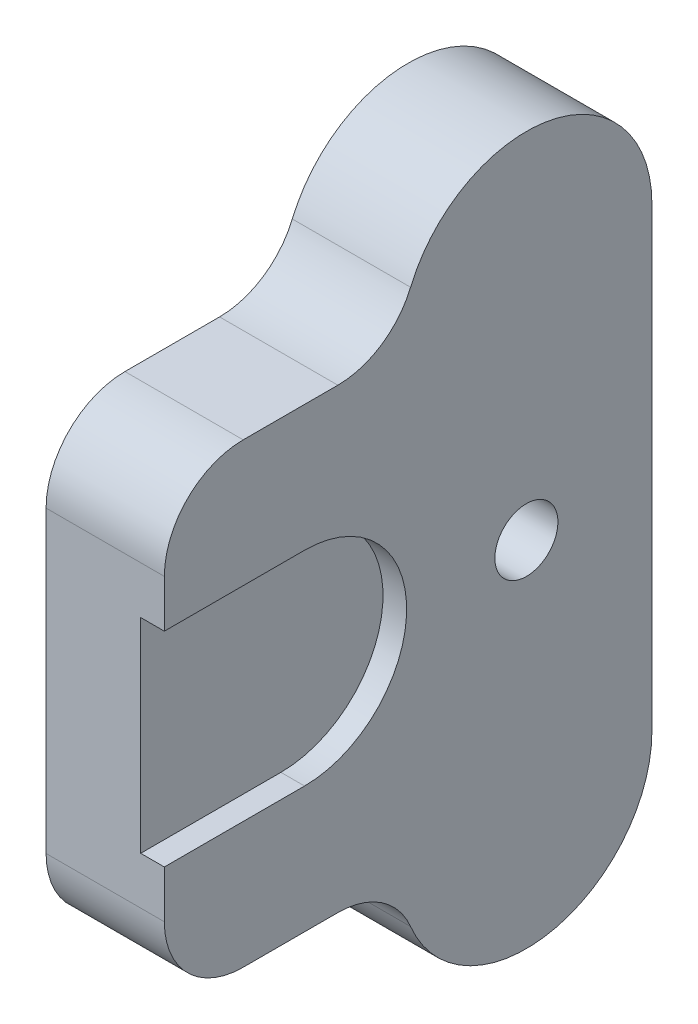
ISO-10303-21;
HEADER;
FILE_DESCRIPTION(('STEP AP214'),'2;1');
FILE_NAME('part.step','',(''),(''),'','','');
FILE_SCHEMA(('AUTOMOTIVE_DESIGN { 1 0 10303 214 1 1 1 1 }'));
ENDSEC;
DATA;
#1=APPLICATION_CONTEXT('core data for automotive mechanical design processes');
#2=APPLICATION_PROTOCOL_DEFINITION('international standard','automotive_design',2000,#1);
#3=PRODUCT_CONTEXT('',#1,'mechanical');
#4=PRODUCT('Part','Part','',(#3));
#5=PRODUCT_RELATED_PRODUCT_CATEGORY('part','',(#4));
#6=PRODUCT_DEFINITION_FORMATION('','',#4);
#7=PRODUCT_DEFINITION_CONTEXT('part definition',#1,'design');
#8=PRODUCT_DEFINITION('design','',#6,#7);
#9=PRODUCT_DEFINITION_SHAPE('','',#8);
#10=(LENGTH_UNIT() NAMED_UNIT(*) SI_UNIT(.MILLI.,.METRE.));
#11=(NAMED_UNIT(*) PLANE_ANGLE_UNIT() SI_UNIT($,.RADIAN.));
#12=(NAMED_UNIT(*) SI_UNIT($,.STERADIAN.) SOLID_ANGLE_UNIT());
#13=UNCERTAINTY_MEASURE_WITH_UNIT(LENGTH_MEASURE(1.E-05),#10,'distance_accuracy_value','');
#14=(GEOMETRIC_REPRESENTATION_CONTEXT(3) GLOBAL_UNCERTAINTY_ASSIGNED_CONTEXT((#13)) GLOBAL_UNIT_ASSIGNED_CONTEXT((#10,
#11,#12)) REPRESENTATION_CONTEXT('',''));
#15=CARTESIAN_POINT('',(0.,0.,0.));
#16=DIRECTION('',(0.,0.,1.));
#17=DIRECTION('',(1.,0.,0.));
#18=AXIS2_PLACEMENT_3D('',#15,#16,#17);
#19=CARTESIAN_POINT('',(15.,-28.9686177509747,3.13232637331732));
#20=DIRECTION('',(-1.,0.,0.));
#21=DIRECTION('',(0.,0.,1.));
#22=AXIS2_PLACEMENT_3D('',#19,#20,#21);
#23=CYLINDRICAL_SURFACE('',#22,15.921660548038);
#24=CARTESIAN_POINT('',(0.,-28.9686177509747,3.13232637331732));
#25=DIRECTION('',(1.,0.,0.));
#26=DIRECTION('',(0.,0.,-1.));
#27=AXIS2_PLACEMENT_3D('',#24,#25,#26);
#28=CIRCLE('',#27,15.921660548038);
#29=CARTESIAN_POINT('',(0.,-35.1108402056403,17.821518928538));
#30=VERTEX_POINT('',#29);
#31=CARTESIAN_POINT('',(0.,-28.9686177509747,-12.7893341747207));
#32=VERTEX_POINT('',#31);
#33=EDGE_CURVE('E168',#30,#32,#28,.T.);
#34=ORIENTED_EDGE('',*,*,#33,.T.);
#35=DIRECTION('',(-1.,0.,0.));
#36=VECTOR('',#35,1.);
#37=CARTESIAN_POINT('',(15.,-28.9686177509747,-12.7893341747207));
#38=LINE('',#37,#36);
#39=CARTESIAN_POINT('',(15.,-28.9686177509747,-12.7893341747207));
#40=VERTEX_POINT('',#39);
#41=EDGE_CURVE('E11',#40,#32,#38,.T.);
#42=ORIENTED_EDGE('',*,*,#41,.F.);
#43=CARTESIAN_POINT('',(15.,-28.9686177509747,3.13232637331732));
#44=DIRECTION('',(1.,0.,0.));
#45=DIRECTION('',(0.,0.,-1.));
#46=AXIS2_PLACEMENT_3D('',#43,#44,#45);
#47=CIRCLE('',#46,15.921660548038);
#48=CARTESIAN_POINT('',(15.,-35.1108402056403,17.821518928538));
#49=VERTEX_POINT('',#48);
#50=EDGE_CURVE('E188',#49,#40,#47,.T.);
#51=ORIENTED_EDGE('',*,*,#50,.F.);
#52=DIRECTION('',(-1.,0.,0.));
#53=VECTOR('',#52,1.);
#54=CARTESIAN_POINT('',(15.,-35.1108402056403,17.821518928538));
#55=LINE('',#54,#53);
#56=EDGE_CURVE('E164',#49,#30,#55,.T.);
#57=ORIENTED_EDGE('',*,*,#56,.T.);
#58=EDGE_LOOP('',(#34,#42,#51,#57));
#59=FACE_BOUND('',#58,.T.);
#60=ADVANCED_FACE('F45',(#59),#23,.T.);
#61=CARTESIAN_POINT('',(15.,-28.9686177509747,-12.7893341747207));
#62=DIRECTION('',(0.,0.,1.));
#63=DIRECTION('',(1.,0.,0.));
#64=AXIS2_PLACEMENT_3D('',#61,#62,#63);
#65=PLANE('',#64);
#66=DIRECTION('',(0.,1.,0.));
#67=VECTOR('',#66,1.);
#68=CARTESIAN_POINT('',(0.,-28.9686177509747,-12.7893341747207));
#69=LINE('',#68,#67);
#70=CARTESIAN_POINT('',(0.,28.9686177509747,-12.7893341747207));
#71=VERTEX_POINT('',#70);
#72=EDGE_CURVE('E171',#32,#71,#69,.T.);
#73=ORIENTED_EDGE('',*,*,#72,.T.);
#74=DIRECTION('',(-1.,0.,0.));
#75=VECTOR('',#74,1.);
#76=CARTESIAN_POINT('',(15.,28.9686177509747,-12.7893341747207));
#77=LINE('',#76,#75);
#78=CARTESIAN_POINT('',(15.,28.9686177509747,-12.7893341747207));
#79=VERTEX_POINT('',#78);
#80=EDGE_CURVE('E52',#79,#71,#77,.T.);
#81=ORIENTED_EDGE('',*,*,#80,.F.);
#82=DIRECTION('',(0.,1.,0.));
#83=VECTOR('',#82,1.);
#84=CARTESIAN_POINT('',(15.,-28.9686177509747,-12.7893341747207));
#85=LINE('',#84,#83);
#86=EDGE_CURVE('E115',#40,#79,#85,.T.);
#87=ORIENTED_EDGE('',*,*,#86,.F.);
#88=ORIENTED_EDGE('',*,*,#41,.T.);
#89=EDGE_LOOP('',(#73,#81,#87,#88));
#90=FACE_BOUND('',#89,.T.);
#91=ADVANCED_FACE('F273',(#90),#65,.F.);
#92=CARTESIAN_POINT('',(15.,28.9686177509747,3.13232637331732));
#93=DIRECTION('',(-1.,0.,0.));
#94=DIRECTION('',(0.,0.,1.));
#95=AXIS2_PLACEMENT_3D('',#92,#93,#94);
#96=CYLINDRICAL_SURFACE('',#95,15.921660548038);
#97=CARTESIAN_POINT('',(0.,28.9686177509747,3.13232637331732));
#98=DIRECTION('',(1.,0.,0.));
#99=DIRECTION('',(0.,0.,1.));
#100=AXIS2_PLACEMENT_3D('',#97,#98,#99);
#101=CIRCLE('',#100,15.921660548038);
#102=CARTESIAN_POINT('',(0.,35.1108402056403,17.821518928538));
#103=VERTEX_POINT('',#102);
#104=EDGE_CURVE('E174',#71,#103,#101,.T.);
#105=ORIENTED_EDGE('',*,*,#104,.T.);
#106=DIRECTION('',(-1.,0.,0.));
#107=VECTOR('',#106,1.);
#108=CARTESIAN_POINT('',(15.,35.1108402056403,17.821518928538));
#109=LINE('',#108,#107);
#110=CARTESIAN_POINT('',(15.,35.1108402056403,17.821518928538));
#111=VERTEX_POINT('',#110);
#112=EDGE_CURVE('E201',#111,#103,#109,.T.);
#113=ORIENTED_EDGE('',*,*,#112,.F.);
#114=CARTESIAN_POINT('',(15.,28.9686177509747,3.13232637331732));
#115=DIRECTION('',(1.,0.,0.));
#116=DIRECTION('',(0.,0.,1.));
#117=AXIS2_PLACEMENT_3D('',#114,#115,#116);
#118=CIRCLE('',#117,15.921660548038);
#119=EDGE_CURVE('E209',#79,#111,#118,.T.);
#120=ORIENTED_EDGE('',*,*,#119,.F.);
#121=ORIENTED_EDGE('',*,*,#80,.T.);
#122=EDGE_LOOP('',(#105,#113,#120,#121));
#123=FACE_BOUND('',#122,.T.);
#124=ADVANCED_FACE('F207',(#123),#96,.T.);
#125=CARTESIAN_POINT('',(15.,38.9686177509747,27.0474363577541));
#126=DIRECTION('',(-1.,0.,0.));
#127=DIRECTION('',(0.,0.,1.));
#128=AXIS2_PLACEMENT_3D('',#125,#126,#127);
#129=CYLINDRICAL_SURFACE('',#128,9.99999999999999);
#130=CARTESIAN_POINT('',(0.,38.9686177509747,27.0474363577541));
#131=DIRECTION('',(-1.,0.,0.));
#132=DIRECTION('',(0.,0.,1.));
#133=AXIS2_PLACEMENT_3D('',#130,#131,#132);
#134=CIRCLE('',#133,9.99999999999999);
#135=CARTESIAN_POINT('',(0.,28.9686177509747,27.0474363577541));
#136=VERTEX_POINT('',#135);
#137=EDGE_CURVE('E176',#103,#136,#134,.T.);
#138=ORIENTED_EDGE('',*,*,#137,.T.);
#139=DIRECTION('',(-1.,0.,0.));
#140=VECTOR('',#139,1.);
#141=CARTESIAN_POINT('',(15.,28.9686177509747,27.0474363577541));
#142=LINE('',#141,#140);
#143=CARTESIAN_POINT('',(15.,28.9686177509747,27.0474363577541));
#144=VERTEX_POINT('',#143);
#145=EDGE_CURVE('E198',#144,#136,#142,.T.);
#146=ORIENTED_EDGE('',*,*,#145,.F.);
#147=CARTESIAN_POINT('',(15.,38.9686177509747,27.0474363577541));
#148=DIRECTION('',(-1.,0.,0.));
#149=DIRECTION('',(0.,0.,1.));
#150=AXIS2_PLACEMENT_3D('',#147,#148,#149);
#151=CIRCLE('',#150,9.99999999999999);
#152=EDGE_CURVE('E227',#111,#144,#151,.T.);
#153=ORIENTED_EDGE('',*,*,#152,.F.);
#154=ORIENTED_EDGE('',*,*,#112,.T.);
#155=EDGE_LOOP('',(#138,#146,#153,#154));
#156=FACE_BOUND('',#155,.T.);
#157=ADVANCED_FACE('F218',(#156),#129,.F.);
#158=CARTESIAN_POINT('',(15.,28.9686177509747,39.0539869213552));
#159=DIRECTION('',(0.,-1.,0.));
#160=DIRECTION('',(0.,0.,-1.));
#161=AXIS2_PLACEMENT_3D('',#158,#159,#160);
#162=PLANE('',#161);
#163=DIRECTION('',(0.,0.,1.));
#164=VECTOR('',#163,1.);
#165=CARTESIAN_POINT('',(0.,28.9686177509747,39.0539869213552));
#166=LINE('',#165,#164);
#167=CARTESIAN_POINT('',(0.,28.9686177509747,39.0539869213552));
#168=VERTEX_POINT('',#167);
#169=EDGE_CURVE('E178',#136,#168,#166,.T.);
#170=ORIENTED_EDGE('',*,*,#169,.T.);
#171=DIRECTION('',(-1.,0.,0.));
#172=VECTOR('',#171,1.);
#173=CARTESIAN_POINT('',(15.,28.9686177509747,39.0539869213552));
#174=LINE('',#173,#172);
#175=CARTESIAN_POINT('',(15.,28.9686177509747,39.0539869213552));
#176=VERTEX_POINT('',#175);
#177=EDGE_CURVE('E195',#176,#168,#174,.T.);
#178=ORIENTED_EDGE('',*,*,#177,.F.);
#179=DIRECTION('',(0.,0.,1.));
#180=VECTOR('',#179,1.);
#181=CARTESIAN_POINT('',(15.,28.9686177509747,39.0539869213552));
#182=LINE('',#181,#180);
#183=EDGE_CURVE('E224',#144,#176,#182,.T.);
#184=ORIENTED_EDGE('',*,*,#183,.F.);
#185=ORIENTED_EDGE('',*,*,#145,.T.);
#186=EDGE_LOOP('',(#170,#178,#184,#185));
#187=FACE_BOUND('',#186,.T.);
#188=ADVANCED_FACE('F222',(#187),#162,.F.);
#189=CARTESIAN_POINT('',(15.,18.9686177509747,39.0539869213552));
#190=DIRECTION('',(-1.,0.,0.));
#191=DIRECTION('',(0.,0.,1.));
#192=AXIS2_PLACEMENT_3D('',#189,#190,#191);
#193=CYLINDRICAL_SURFACE('',#192,10.);
#194=CARTESIAN_POINT('',(0.,18.9686177509747,39.0539869213552));
#195=DIRECTION('',(1.,0.,0.));
#196=DIRECTION('',(0.,0.,1.));
#197=AXIS2_PLACEMENT_3D('',#194,#195,#196);
#198=CIRCLE('',#197,10.);
#199=CARTESIAN_POINT('',(0.,18.9686177509747,49.0539869213552));
#200=VERTEX_POINT('',#199);
#201=EDGE_CURVE('E180',#168,#200,#198,.T.);
#202=ORIENTED_EDGE('',*,*,#201,.T.);
#203=DIRECTION('',(-1.,0.,0.));
#204=VECTOR('',#203,1.);
#205=CARTESIAN_POINT('',(15.,18.9686177509747,49.0539869213552));
#206=LINE('',#205,#204);
#207=CARTESIAN_POINT('',(15.,18.9686177509747,49.0539869213552));
#208=VERTEX_POINT('',#207);
#209=EDGE_CURVE('E192',#208,#200,#206,.T.);
#210=ORIENTED_EDGE('',*,*,#209,.F.);
#211=CARTESIAN_POINT('',(15.,18.9686177509747,39.0539869213552));
#212=DIRECTION('',(1.,0.,0.));
#213=DIRECTION('',(0.,0.,1.));
#214=AXIS2_PLACEMENT_3D('',#211,#212,#213);
#215=CIRCLE('',#214,10.);
#216=EDGE_CURVE('E226',#176,#208,#215,.T.);
#217=ORIENTED_EDGE('',*,*,#216,.F.);
#218=ORIENTED_EDGE('',*,*,#177,.T.);
#219=EDGE_LOOP('',(#202,#210,#217,#218));
#220=FACE_BOUND('',#219,.T.);
#221=ADVANCED_FACE('F285',(#220),#193,.T.);
#222=CARTESIAN_POINT('',(15.,18.9686177509747,49.0539869213552));
#223=DIRECTION('',(0.,0.,-1.));
#224=DIRECTION('',(0.,1.,0.));
#225=AXIS2_PLACEMENT_3D('',#222,#223,#224);
#226=PLANE('',#225);
#227=DIRECTION('',(0.,-1.,0.));
#228=VECTOR('',#227,1.);
#229=CARTESIAN_POINT('',(12.,-12.95,49.0539869213552));
#230=LINE('',#229,#228);
#231=CARTESIAN_POINT('',(12.,12.95,49.0539869213552));
#232=VERTEX_POINT('',#231);
#233=CARTESIAN_POINT('',(12.,-12.95,49.0539869213552));
#234=VERTEX_POINT('',#233);
#235=EDGE_CURVE('E248',#232,#234,#230,.T.);
#236=ORIENTED_EDGE('',*,*,#235,.F.);
#237=DIRECTION('',(1.,0.,0.));
#238=VECTOR('',#237,1.);
#239=CARTESIAN_POINT('',(12.,12.95,49.0539869213552));
#240=LINE('',#239,#238);
#241=CARTESIAN_POINT('',(15.,12.95,49.0539869213552));
#242=VERTEX_POINT('',#241);
#243=EDGE_CURVE('E246',#232,#242,#240,.T.);
#244=ORIENTED_EDGE('',*,*,#243,.T.);
#245=DIRECTION('',(0.,-1.,0.));
#246=VECTOR('',#245,1.);
#247=CARTESIAN_POINT('',(15.,18.9686177509747,49.0539869213552));
#248=LINE('',#247,#246);
#249=EDGE_CURVE('E150',#208,#242,#248,.T.);
#250=ORIENTED_EDGE('',*,*,#249,.F.);
#251=ORIENTED_EDGE('',*,*,#209,.T.);
#252=DIRECTION('',(0.,-1.,0.));
#253=VECTOR('',#252,1.);
#254=CARTESIAN_POINT('',(0.,18.9686177509747,49.0539869213552));
#255=LINE('',#254,#253);
#256=CARTESIAN_POINT('',(0.,-18.9686177509747,49.0539869213552));
#257=VERTEX_POINT('',#256);
#258=EDGE_CURVE('E182',#200,#257,#255,.T.);
#259=ORIENTED_EDGE('',*,*,#258,.T.);
#260=DIRECTION('',(-1.,0.,0.));
#261=VECTOR('',#260,1.);
#262=CARTESIAN_POINT('',(15.,-18.9686177509747,49.0539869213552));
#263=LINE('',#262,#261);
#264=CARTESIAN_POINT('',(15.,-18.9686177509747,49.0539869213552));
#265=VERTEX_POINT('',#264);
#266=EDGE_CURVE('E159',#265,#257,#263,.T.);
#267=ORIENTED_EDGE('',*,*,#266,.F.);
#268=CARTESIAN_POINT('',(15.,-12.95,49.0539869213552));
#269=VERTEX_POINT('',#268);
#270=EDGE_CURVE('E146',#269,#265,#248,.T.);
#271=ORIENTED_EDGE('',*,*,#270,.F.);
#272=DIRECTION('',(1.,0.,0.));
#273=VECTOR('',#272,1.);
#274=CARTESIAN_POINT('',(12.,-12.95,49.0539869213552));
#275=LINE('',#274,#273);
#276=EDGE_CURVE('E59',#234,#269,#275,.T.);
#277=ORIENTED_EDGE('',*,*,#276,.F.);
#278=EDGE_LOOP('',(#236,#244,#250,#251,#259,#267,#271,#277));
#279=FACE_BOUND('',#278,.T.);
#280=ADVANCED_FACE('F243',(#279),#226,.F.);
#281=CARTESIAN_POINT('',(15.,-18.9686177509747,39.0539869213552));
#282=DIRECTION('',(-1.,0.,0.));
#283=DIRECTION('',(0.,0.,1.));
#284=AXIS2_PLACEMENT_3D('',#281,#282,#283);
#285=CYLINDRICAL_SURFACE('',#284,10.);
#286=CARTESIAN_POINT('',(0.,-18.9686177509747,39.0539869213552));
#287=DIRECTION('',(1.,0.,0.));
#288=DIRECTION('',(0.,0.,-1.));
#289=AXIS2_PLACEMENT_3D('',#286,#287,#288);
#290=CIRCLE('',#289,10.);
#291=CARTESIAN_POINT('',(0.,-28.9686177509747,39.0539869213552));
#292=VERTEX_POINT('',#291);
#293=EDGE_CURVE('E156',#257,#292,#290,.T.);
#294=ORIENTED_EDGE('',*,*,#293,.T.);
#295=DIRECTION('',(-1.,0.,0.));
#296=VECTOR('',#295,1.);
#297=CARTESIAN_POINT('',(15.,-28.9686177509747,39.0539869213552));
#298=LINE('',#297,#296);
#299=CARTESIAN_POINT('',(15.,-28.9686177509747,39.0539869213552));
#300=VERTEX_POINT('',#299);
#301=EDGE_CURVE('E153',#300,#292,#298,.T.);
#302=ORIENTED_EDGE('',*,*,#301,.F.);
#303=CARTESIAN_POINT('',(15.,-18.9686177509747,39.0539869213552));
#304=DIRECTION('',(1.,0.,0.));
#305=DIRECTION('',(0.,0.,-1.));
#306=AXIS2_PLACEMENT_3D('',#303,#304,#305);
#307=CIRCLE('',#306,10.);
#308=EDGE_CURVE('E137',#265,#300,#307,.T.);
#309=ORIENTED_EDGE('',*,*,#308,.F.);
#310=ORIENTED_EDGE('',*,*,#266,.T.);
#311=EDGE_LOOP('',(#294,#302,#309,#310));
#312=FACE_BOUND('',#311,.T.);
#313=ADVANCED_FACE('F154',(#312),#285,.T.);
#314=CARTESIAN_POINT('',(15.,-28.9686177509747,39.0539869213552));
#315=DIRECTION('',(0.,1.,0.));
#316=DIRECTION('',(0.,0.,1.));
#317=AXIS2_PLACEMENT_3D('',#314,#315,#316);
#318=PLANE('',#317);
#319=DIRECTION('',(0.,0.,-1.));
#320=VECTOR('',#319,1.);
#321=CARTESIAN_POINT('',(0.,-28.9686177509747,39.0539869213552));
#322=LINE('',#321,#320);
#323=CARTESIAN_POINT('',(0.,-28.9686177509747,27.0474363577541));
#324=VERTEX_POINT('',#323);
#325=EDGE_CURVE('E185',#292,#324,#322,.T.);
#326=ORIENTED_EDGE('',*,*,#325,.T.);
#327=DIRECTION('',(-1.,0.,0.));
#328=VECTOR('',#327,1.);
#329=CARTESIAN_POINT('',(15.,-28.9686177509747,27.0474363577541));
#330=LINE('',#329,#328);
#331=CARTESIAN_POINT('',(15.,-28.9686177509747,27.0474363577541));
#332=VERTEX_POINT('',#331);
#333=EDGE_CURVE('E160',#332,#324,#330,.T.);
#334=ORIENTED_EDGE('',*,*,#333,.F.);
#335=DIRECTION('',(0.,0.,-1.));
#336=VECTOR('',#335,1.);
#337=CARTESIAN_POINT('',(15.,-28.9686177509747,39.0539869213552));
#338=LINE('',#337,#336);
#339=EDGE_CURVE('E143',#300,#332,#338,.T.);
#340=ORIENTED_EDGE('',*,*,#339,.F.);
#341=ORIENTED_EDGE('',*,*,#301,.T.);
#342=EDGE_LOOP('',(#326,#334,#340,#341));
#343=FACE_BOUND('',#342,.T.);
#344=ADVANCED_FACE('F162',(#343),#318,.F.);
#345=CARTESIAN_POINT('',(15.,-38.9686177509747,27.0474363577541));
#346=DIRECTION('',(-1.,0.,0.));
#347=DIRECTION('',(0.,0.,1.));
#348=AXIS2_PLACEMENT_3D('',#345,#346,#347);
#349=CYLINDRICAL_SURFACE('',#348,9.99999999999999);
#350=CARTESIAN_POINT('',(0.,-38.9686177509747,27.0474363577541));
#351=DIRECTION('',(-1.,0.,0.));
#352=DIRECTION('',(0.,0.,-1.));
#353=AXIS2_PLACEMENT_3D('',#350,#351,#352);
#354=CIRCLE('',#353,9.99999999999999);
#355=EDGE_CURVE('E107',#324,#30,#354,.T.);
#356=ORIENTED_EDGE('',*,*,#355,.T.);
#357=ORIENTED_EDGE('',*,*,#56,.F.);
#358=CARTESIAN_POINT('',(15.,-38.9686177509747,27.0474363577541));
#359=DIRECTION('',(-1.,0.,0.));
#360=DIRECTION('',(0.,0.,-1.));
#361=AXIS2_PLACEMENT_3D('',#358,#359,#360);
#362=CIRCLE('',#361,9.99999999999999);
#363=EDGE_CURVE('E68',#332,#49,#362,.T.);
#364=ORIENTED_EDGE('',*,*,#363,.F.);
#365=ORIENTED_EDGE('',*,*,#333,.T.);
#366=EDGE_LOOP('',(#356,#357,#364,#365));
#367=FACE_BOUND('',#366,.T.);
#368=ADVANCED_FACE('F295',(#367),#349,.F.);
#369=CARTESIAN_POINT('',(15.,-28.9686177509747,3.13232637331732));
#370=DIRECTION('',(1.,0.,0.));
#371=DIRECTION('',(0.,0.,-1.));
#372=AXIS2_PLACEMENT_3D('',#369,#370,#371);
#373=PLANE('',#372);
#374=DIRECTION('',(0.,0.,1.));
#375=VECTOR('',#374,1.);
#376=CARTESIAN_POINT('',(15.,12.95,31.2677038838304));
#377=LINE('',#376,#375);
#378=CARTESIAN_POINT('',(15.,12.95,31.2677038838304));
#379=VERTEX_POINT('',#378);
#380=EDGE_CURVE('E237',#379,#242,#377,.T.);
#381=ORIENTED_EDGE('',*,*,#380,.F.);
#382=CARTESIAN_POINT('',(15.,0.,31.2677038838304));
#383=DIRECTION('',(1.,0.,0.));
#384=DIRECTION('',(0.,0.,-1.));
#385=AXIS2_PLACEMENT_3D('',#382,#383,#384);
#386=CIRCLE('',#385,12.95);
#387=CARTESIAN_POINT('',(15.,-12.95,31.2677038838304));
#388=VERTEX_POINT('',#387);
#389=EDGE_CURVE('E333',#388,#379,#386,.T.);
#390=ORIENTED_EDGE('',*,*,#389,.F.);
#391=DIRECTION('',(0.,0.,-1.));
#392=VECTOR('',#391,1.);
#393=CARTESIAN_POINT('',(15.,-12.95,49.0539869213552));
#394=LINE('',#393,#392);
#395=EDGE_CURVE('E337',#269,#388,#394,.T.);
#396=ORIENTED_EDGE('',*,*,#395,.F.);
#397=ORIENTED_EDGE('',*,*,#270,.T.);
#398=ORIENTED_EDGE('',*,*,#308,.T.);
#399=ORIENTED_EDGE('',*,*,#339,.T.);
#400=ORIENTED_EDGE('',*,*,#363,.T.);
#401=ORIENTED_EDGE('',*,*,#50,.T.);
#402=ORIENTED_EDGE('',*,*,#86,.T.);
#403=ORIENTED_EDGE('',*,*,#119,.T.);
#404=ORIENTED_EDGE('',*,*,#152,.T.);
#405=ORIENTED_EDGE('',*,*,#183,.T.);
#406=ORIENTED_EDGE('',*,*,#216,.T.);
#407=ORIENTED_EDGE('',*,*,#249,.T.);
#408=EDGE_LOOP('',(#381,#390,#396,#397,#398,#399,#400,#401,#402,#403,#404,#405,#406,#407));
#409=FACE_BOUND('',#408,.T.);
#410=CARTESIAN_POINT('',(15.,0.,3.13232637331727));
#411=DIRECTION('',(1.,0.,0.));
#412=DIRECTION('',(0.,0.,-1.));
#413=AXIS2_PLACEMENT_3D('',#410,#411,#412);
#414=CIRCLE('',#413,4.);
#415=CARTESIAN_POINT('',(15.,0.,-0.867673626682733));
#416=VERTEX_POINT('',#415);
#417=EDGE_CURVE('E252',#416,#416,#414,.T.);
#418=ORIENTED_EDGE('',*,*,#417,.F.);
#419=EDGE_LOOP('',(#418));
#420=FACE_BOUND('',#419,.T.);
#421=ADVANCED_FACE('F140',(#409,#420),#373,.T.);
#422=CARTESIAN_POINT('',(0.,-28.9686177509747,3.13232637331732));
#423=DIRECTION('',(1.,0.,0.));
#424=DIRECTION('',(0.,0.,-1.));
#425=AXIS2_PLACEMENT_3D('',#422,#423,#424);
#426=PLANE('',#425);
#427=ORIENTED_EDGE('',*,*,#33,.F.);
#428=ORIENTED_EDGE('',*,*,#355,.F.);
#429=ORIENTED_EDGE('',*,*,#325,.F.);
#430=ORIENTED_EDGE('',*,*,#293,.F.);
#431=ORIENTED_EDGE('',*,*,#258,.F.);
#432=ORIENTED_EDGE('',*,*,#201,.F.);
#433=ORIENTED_EDGE('',*,*,#169,.F.);
#434=ORIENTED_EDGE('',*,*,#137,.F.);
#435=ORIENTED_EDGE('',*,*,#104,.F.);
#436=ORIENTED_EDGE('',*,*,#72,.F.);
#437=EDGE_LOOP('',(#427,#428,#429,#430,#431,#432,#433,#434,#435,#436));
#438=FACE_BOUND('',#437,.T.);
#439=ADVANCED_FACE('F213',(#438),#426,.F.);
#440=CARTESIAN_POINT('',(0.953799999999999,0.,3.13232637331727));
#441=DIRECTION('',(1.,0.,0.));
#442=DIRECTION('',(0.,0.,-1.));
#443=AXIS2_PLACEMENT_3D('',#440,#441,#442);
#444=CYLINDRICAL_SURFACE('',#443,4.);
#445=CARTESIAN_POINT('',(0.953799999999999,0.,3.13232637331727));
#446=DIRECTION('',(1.,0.,0.));
#447=DIRECTION('',(0.,0.,-1.));
#448=AXIS2_PLACEMENT_3D('',#445,#446,#447);
#449=CIRCLE('',#448,4.);
#450=CARTESIAN_POINT('',(0.953799999999999,0.,-0.867673626682733));
#451=VERTEX_POINT('',#450);
#452=EDGE_CURVE('E172',#451,#451,#449,.T.);
#453=CARTESIAN_POINT('',(0.953799999999999,0.,-0.867673626682733));
#454=CARTESIAN_POINT('',(1.10011458333333,0.,-0.867673626682733));
#455=CARTESIAN_POINT('',(1.24642916666667,0.,-0.867673626682733));
#456=CARTESIAN_POINT('',(1.53905833333333,0.,-0.867673626682733));
#457=CARTESIAN_POINT('',(1.68537291666667,0.,-0.867673626682733));
#458=CARTESIAN_POINT('',(1.97800208333333,0.,-0.867673626682733));
#459=CARTESIAN_POINT('',(2.12431666666667,0.,-0.867673626682733));
#460=CARTESIAN_POINT('',(2.41694583333333,0.,-0.867673626682733));
#461=CARTESIAN_POINT('',(2.56326041666667,0.,-0.867673626682733));
#462=CARTESIAN_POINT('',(2.85588958333333,0.,-0.867673626682733));
#463=CARTESIAN_POINT('',(3.00220416666667,0.,-0.867673626682733));
#464=CARTESIAN_POINT('',(3.29483333333333,0.,-0.867673626682733));
#465=CARTESIAN_POINT('',(3.44114791666667,0.,-0.867673626682733));
#466=CARTESIAN_POINT('',(3.73377708333333,0.,-0.867673626682733));
#467=CARTESIAN_POINT('',(3.88009166666667,0.,-0.867673626682733));
#468=CARTESIAN_POINT('',(4.17272083333333,0.,-0.867673626682733));
#469=CARTESIAN_POINT('',(4.31903541666667,0.,-0.867673626682733));
#470=CARTESIAN_POINT('',(4.61166458333333,0.,-0.867673626682733));
#471=CARTESIAN_POINT('',(4.75797916666667,0.,-0.867673626682733));
#472=CARTESIAN_POINT('',(5.05060833333333,0.,-0.867673626682733));
#473=CARTESIAN_POINT('',(5.19692291666667,0.,-0.867673626682733));
#474=CARTESIAN_POINT('',(5.48955208333333,0.,-0.867673626682733));
#475=CARTESIAN_POINT('',(5.63586666666667,0.,-0.867673626682733));
#476=CARTESIAN_POINT('',(5.92849583333333,0.,-0.867673626682733));
#477=CARTESIAN_POINT('',(6.07481041666667,0.,-0.867673626682733));
#478=CARTESIAN_POINT('',(6.36743958333333,0.,-0.867673626682733));
#479=CARTESIAN_POINT('',(6.51375416666667,0.,-0.867673626682733));
#480=CARTESIAN_POINT('',(6.80638333333333,0.,-0.867673626682733));
#481=CARTESIAN_POINT('',(6.95269791666667,0.,-0.867673626682733));
#482=CARTESIAN_POINT('',(7.24532708333333,0.,-0.867673626682733));
#483=CARTESIAN_POINT('',(7.39164166666667,0.,-0.867673626682733));
#484=CARTESIAN_POINT('',(7.68427083333333,0.,-0.867673626682733));
#485=CARTESIAN_POINT('',(7.83058541666667,0.,-0.867673626682733));
#486=CARTESIAN_POINT('',(8.12321458333333,0.,-0.867673626682733));
#487=CARTESIAN_POINT('',(8.26952916666667,0.,-0.867673626682733));
#488=CARTESIAN_POINT('',(8.56215833333333,0.,-0.867673626682733));
#489=CARTESIAN_POINT('',(8.70847291666667,0.,-0.867673626682733));
#490=CARTESIAN_POINT('',(9.00110208333333,0.,-0.867673626682733));
#491=CARTESIAN_POINT('',(9.14741666666667,0.,-0.867673626682733));
#492=CARTESIAN_POINT('',(9.44004583333333,0.,-0.867673626682733));
#493=CARTESIAN_POINT('',(9.58636041666667,0.,-0.867673626682733));
#494=CARTESIAN_POINT('',(9.87898958333333,0.,-0.867673626682733));
#495=CARTESIAN_POINT('',(10.0253041666667,0.,-0.867673626682733));
#496=CARTESIAN_POINT('',(10.3179333333333,0.,-0.867673626682733));
#497=CARTESIAN_POINT('',(10.4642479166667,0.,-0.867673626682733));
#498=CARTESIAN_POINT('',(10.7568770833333,0.,-0.867673626682733));
#499=CARTESIAN_POINT('',(10.9031916666667,0.,-0.867673626682733));
#500=CARTESIAN_POINT('',(11.1958208333333,0.,-0.867673626682733));
#501=CARTESIAN_POINT('',(11.3421354166667,0.,-0.867673626682733));
#502=CARTESIAN_POINT('',(11.6347645833333,0.,-0.867673626682733));
#503=CARTESIAN_POINT('',(11.7810791666667,0.,-0.867673626682733));
#504=CARTESIAN_POINT('',(12.0737083333333,0.,-0.867673626682733));
#505=CARTESIAN_POINT('',(12.2200229166667,0.,-0.867673626682733));
#506=CARTESIAN_POINT('',(12.5126520833333,0.,-0.867673626682733));
#507=CARTESIAN_POINT('',(12.6589666666667,0.,-0.867673626682733));
#508=CARTESIAN_POINT('',(12.9515958333333,0.,-0.867673626682733));
#509=CARTESIAN_POINT('',(13.0979104166667,0.,-0.867673626682733));
#510=CARTESIAN_POINT('',(13.3905395833333,0.,-0.867673626682733));
#511=CARTESIAN_POINT('',(13.5368541666667,0.,-0.867673626682733));
#512=CARTESIAN_POINT('',(13.8294833333333,0.,-0.867673626682733));
#513=CARTESIAN_POINT('',(13.9757979166667,0.,-0.867673626682733));
#514=CARTESIAN_POINT('',(14.2684270833333,0.,-0.867673626682733));
#515=CARTESIAN_POINT('',(14.4147416666667,0.,-0.867673626682733));
#516=CARTESIAN_POINT('',(14.7073708333333,0.,-0.867673626682733));
#517=CARTESIAN_POINT('',(14.8536854166667,0.,-0.867673626682733));
#518=CARTESIAN_POINT('',(15.,0.,-0.867673626682733));
#519=B_SPLINE_CURVE_WITH_KNOTS('',3,(#453,#454,#455,#456,#457,#458,#459,#460,#461,#462,#463,
#464,#465,#466,#467,#468,#469,#470,#471,#472,#473,#474,#475,#476,#477,#478,#479,#480,#481,#482,
#483,#484,#485,#486,#487,#488,#489,#490,#491,#492,#493,#494,#495,#496,#497,#498,#499,#500,#501,
#502,#503,#504,#505,#506,#507,#508,#509,#510,#511,#512,#513,#514,#515,#516,#517,#518),
.UNSPECIFIED.,.F.,.F.,(4,2,2,2,2,2,2,2,2,2,2,2,2,2,2,2,2,2,2,2,2,2,2,2,2,2,2,2,2,2,2,2,4),(0.,
0.43894375,0.8778875,1.31683125,1.755775,2.19471875,2.6336625,3.07260625,3.51155,3.95049375,
4.3894375,4.82838125,5.267325,5.70626875,6.1452125,6.58415625,7.0231,7.46204375,7.9009875,
8.33993125,8.778875,9.21781875,9.6567625,10.09570625,10.53465,10.97359375,11.4125375,
11.85148125,12.290425,12.72936875,13.1683125,13.60725625,14.0462),.UNSPECIFIED.);
#520=EDGE_CURVE('BSEAM300',#451,#416,#519,.T.);
#521=ORIENTED_EDGE('',*,*,#452,.F.);
#522=ORIENTED_EDGE('',*,*,#417,.T.);
#523=ORIENTED_EDGE('',*,*,#520,.T.);
#524=ORIENTED_EDGE('',*,*,#520,.F.);
#525=EDGE_LOOP('',(#521,#523,#522,#524));
#526=FACE_BOUND('',#525,.T.);
#527=ADVANCED_FACE('F300',(#526),#444,.F.);
#528=CARTESIAN_POINT('',(0.953799999999999,0.,3.13232637331727));
#529=DIRECTION('',(1.,0.,0.));
#530=DIRECTION('',(0.,0.,-1.));
#531=AXIS2_PLACEMENT_3D('',#528,#529,#530);
#532=PLANE('',#531);
#533=ORIENTED_EDGE('',*,*,#452,.T.);
#534=EDGE_LOOP('',(#533));
#535=FACE_BOUND('',#534,.T.);
#536=ADVANCED_FACE('F305',(#535),#532,.T.);
#537=CARTESIAN_POINT('',(12.,12.95,31.2677038838304));
#538=DIRECTION('',(0.,1.,0.));
#539=DIRECTION('',(0.,0.,1.));
#540=AXIS2_PLACEMENT_3D('',#537,#538,#539);
#541=PLANE('',#540);
#542=ORIENTED_EDGE('',*,*,#380,.T.);
#543=ORIENTED_EDGE('',*,*,#243,.F.);
#544=DIRECTION('',(0.,0.,1.));
#545=VECTOR('',#544,1.);
#546=CARTESIAN_POINT('',(12.,12.95,31.2677038838304));
#547=LINE('',#546,#545);
#548=CARTESIAN_POINT('',(12.,12.95,31.2677038838304));
#549=VERTEX_POINT('',#548);
#550=EDGE_CURVE('E266',#549,#232,#547,.T.);
#551=ORIENTED_EDGE('',*,*,#550,.F.);
#552=DIRECTION('',(1.,0.,0.));
#553=VECTOR('',#552,1.);
#554=CARTESIAN_POINT('',(12.,12.95,31.2677038838304));
#555=LINE('',#554,#553);
#556=EDGE_CURVE('E253',#549,#379,#555,.T.);
#557=ORIENTED_EDGE('',*,*,#556,.T.);
#558=EDGE_LOOP('',(#542,#543,#551,#557));
#559=FACE_BOUND('',#558,.T.);
#560=ADVANCED_FACE('F309',(#559),#541,.F.);
#561=CARTESIAN_POINT('',(12.,0.,31.2677038838304));
#562=DIRECTION('',(1.,0.,0.));
#563=DIRECTION('',(0.,0.,-1.));
#564=AXIS2_PLACEMENT_3D('',#561,#562,#563);
#565=CYLINDRICAL_SURFACE('',#564,12.95);
#566=ORIENTED_EDGE('',*,*,#389,.T.);
#567=ORIENTED_EDGE('',*,*,#556,.F.);
#568=CARTESIAN_POINT('',(12.,0.,31.2677038838304));
#569=DIRECTION('',(1.,0.,0.));
#570=DIRECTION('',(0.,0.,-1.));
#571=AXIS2_PLACEMENT_3D('',#568,#569,#570);
#572=CIRCLE('',#571,12.95);
#573=CARTESIAN_POINT('',(12.,-12.95,31.2677038838304));
#574=VERTEX_POINT('',#573);
#575=EDGE_CURVE('E331',#574,#549,#572,.T.);
#576=ORIENTED_EDGE('',*,*,#575,.F.);
#577=DIRECTION('',(1.,0.,0.));
#578=VECTOR('',#577,1.);
#579=CARTESIAN_POINT('',(12.,-12.95,31.2677038838304));
#580=LINE('',#579,#578);
#581=EDGE_CURVE('E258',#574,#388,#580,.T.);
#582=ORIENTED_EDGE('',*,*,#581,.T.);
#583=EDGE_LOOP('',(#566,#567,#576,#582));
#584=FACE_BOUND('',#583,.T.);
#585=ADVANCED_FACE('F315',(#584),#565,.F.);
#586=CARTESIAN_POINT('',(12.,-12.95,49.0539869213552));
#587=DIRECTION('',(0.,-1.,0.));
#588=DIRECTION('',(0.,0.,-1.));
#589=AXIS2_PLACEMENT_3D('',#586,#587,#588);
#590=PLANE('',#589);
#591=ORIENTED_EDGE('',*,*,#395,.T.);
#592=ORIENTED_EDGE('',*,*,#581,.F.);
#593=DIRECTION('',(0.,0.,-1.));
#594=VECTOR('',#593,1.);
#595=CARTESIAN_POINT('',(12.,-12.95,49.0539869213552));
#596=LINE('',#595,#594);
#597=EDGE_CURVE('E328',#234,#574,#596,.T.);
#598=ORIENTED_EDGE('',*,*,#597,.F.);
#599=ORIENTED_EDGE('',*,*,#276,.T.);
#600=EDGE_LOOP('',(#591,#592,#598,#599));
#601=FACE_BOUND('',#600,.T.);
#602=ADVANCED_FACE('F311',(#601),#590,.F.);
#603=CARTESIAN_POINT('',(12.,0.,31.2677038838304));
#604=DIRECTION('',(1.,0.,0.));
#605=DIRECTION('',(0.,0.,-1.));
#606=AXIS2_PLACEMENT_3D('',#603,#604,#605);
#607=PLANE('',#606);
#608=ORIENTED_EDGE('',*,*,#235,.T.);
#609=ORIENTED_EDGE('',*,*,#597,.T.);
#610=ORIENTED_EDGE('',*,*,#575,.T.);
#611=ORIENTED_EDGE('',*,*,#550,.T.);
#612=EDGE_LOOP('',(#608,#609,#610,#611));
#613=FACE_BOUND('',#612,.T.);
#614=ADVANCED_FACE('F314',(#613),#607,.T.);
#615=CLOSED_SHELL('',(#60,#91,#124,#157,#188,#221,#280,#313,#344,#368,#421,#439,#527,#536,#560,
#585,#602,#614));
#616=MANIFOLD_SOLID_BREP('B2',#615);
#617=ADVANCED_BREP_SHAPE_REPRESENTATION('',(#18,#616),#14);
#618=SHAPE_DEFINITION_REPRESENTATION(#9,#617);
ENDSEC;
END-ISO-10303-21;
